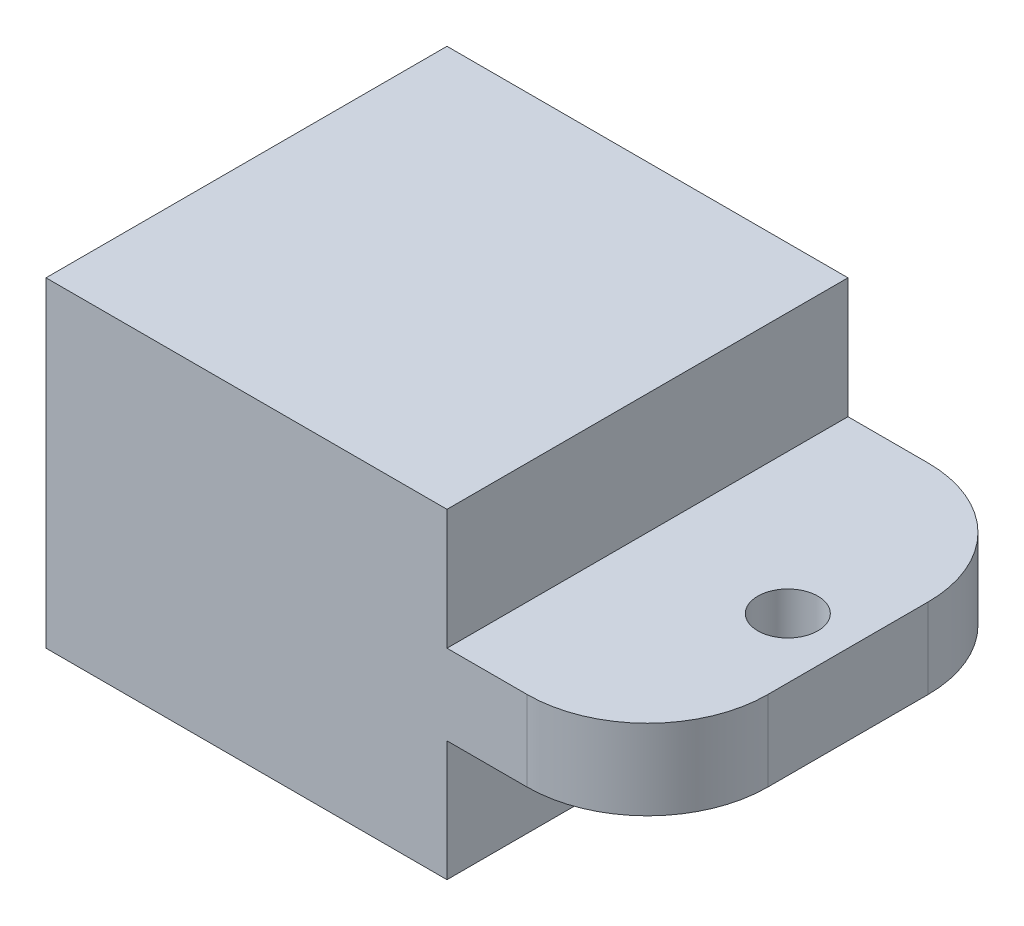
ISO-10303-21;
HEADER;
FILE_DESCRIPTION(('STEP AP214'),'2;1');
FILE_NAME('part.step','',(''),(''),'','','');
FILE_SCHEMA(('AUTOMOTIVE_DESIGN { 1 0 10303 214 1 1 1 1 }'));
ENDSEC;
DATA;
#1=APPLICATION_CONTEXT('core data for automotive mechanical design processes');
#2=APPLICATION_PROTOCOL_DEFINITION('international standard','automotive_design',2000,#1);
#3=PRODUCT_CONTEXT('',#1,'mechanical');
#4=PRODUCT('Part','Part','',(#3));
#5=PRODUCT_RELATED_PRODUCT_CATEGORY('part','',(#4));
#6=PRODUCT_DEFINITION_FORMATION('','',#4);
#7=PRODUCT_DEFINITION_CONTEXT('part definition',#1,'design');
#8=PRODUCT_DEFINITION('design','',#6,#7);
#9=PRODUCT_DEFINITION_SHAPE('','',#8);
#10=(LENGTH_UNIT() NAMED_UNIT(*) SI_UNIT(.MILLI.,.METRE.));
#11=(NAMED_UNIT(*) PLANE_ANGLE_UNIT() SI_UNIT($,.RADIAN.));
#12=(NAMED_UNIT(*) SI_UNIT($,.STERADIAN.) SOLID_ANGLE_UNIT());
#13=UNCERTAINTY_MEASURE_WITH_UNIT(LENGTH_MEASURE(1.E-05),#10,'distance_accuracy_value','');
#14=(GEOMETRIC_REPRESENTATION_CONTEXT(3) GLOBAL_UNCERTAINTY_ASSIGNED_CONTEXT((#13)) GLOBAL_UNIT_ASSIGNED_CONTEXT((#10,
#11,#12)) REPRESENTATION_CONTEXT('',''));
#15=CARTESIAN_POINT('',(0.,0.,0.));
#16=DIRECTION('',(0.,0.,1.));
#17=DIRECTION('',(1.,0.,0.));
#18=AXIS2_PLACEMENT_3D('',#15,#16,#17);
#19=CARTESIAN_POINT('',(-75.,0.,-50.));
#20=DIRECTION('',(-1.,0.,0.));
#21=DIRECTION('',(0.,0.,1.));
#22=AXIS2_PLACEMENT_3D('',#19,#20,#21);
#23=PLANE('',#22);
#24=DIRECTION('',(0.,-1.,0.));
#25=VECTOR('',#24,1.);
#26=CARTESIAN_POINT('',(-75.,0.,-50.));
#27=LINE('',#26,#25);
#28=CARTESIAN_POINT('',(-75.,40.,-50.));
#29=VERTEX_POINT('',#28);
#30=CARTESIAN_POINT('',(-75.,-40.,-50.));
#31=VERTEX_POINT('',#30);
#32=EDGE_CURVE('E136',#29,#31,#27,.T.);
#33=ORIENTED_EDGE('',*,*,#32,.T.);
#34=DIRECTION('',(0.,0.,1.));
#35=VECTOR('',#34,1.);
#36=CARTESIAN_POINT('',(-75.,-40.,-50.));
#37=LINE('',#36,#35);
#38=CARTESIAN_POINT('',(-75.,-40.,50.));
#39=VERTEX_POINT('',#38);
#40=EDGE_CURVE('E134',#31,#39,#37,.T.);
#41=ORIENTED_EDGE('',*,*,#40,.T.);
#42=DIRECTION('',(0.,-1.,0.));
#43=VECTOR('',#42,1.);
#44=CARTESIAN_POINT('',(-75.,0.,50.));
#45=LINE('',#44,#43);
#46=CARTESIAN_POINT('',(-75.,40.,50.));
#47=VERTEX_POINT('',#46);
#48=EDGE_CURVE('E118',#47,#39,#45,.T.);
#49=ORIENTED_EDGE('',*,*,#48,.F.);
#50=DIRECTION('',(0.,0.,1.));
#51=VECTOR('',#50,1.);
#52=CARTESIAN_POINT('',(-75.,40.,-50.));
#53=LINE('',#52,#51);
#54=EDGE_CURVE('E199',#29,#47,#53,.T.);
#55=ORIENTED_EDGE('',*,*,#54,.F.);
#56=EDGE_LOOP('',(#33,#41,#49,#55));
#57=FACE_BOUND('',#56,.T.);
#58=ADVANCED_FACE('F39',(#57),#23,.T.);
#59=CARTESIAN_POINT('',(-75.,40.,-50.));
#60=DIRECTION('',(0.,1.,0.));
#61=DIRECTION('',(-1.,0.,0.));
#62=AXIS2_PLACEMENT_3D('',#59,#60,#61);
#63=PLANE('',#62);
#64=ORIENTED_EDGE('',*,*,#54,.T.);
#65=DIRECTION('',(-1.,0.,0.));
#66=VECTOR('',#65,1.);
#67=CARTESIAN_POINT('',(-75.,40.,50.));
#68=LINE('',#67,#66);
#69=CARTESIAN_POINT('',(25.,40.,50.));
#70=VERTEX_POINT('',#69);
#71=EDGE_CURVE('E128',#70,#47,#68,.T.);
#72=ORIENTED_EDGE('',*,*,#71,.F.);
#73=DIRECTION('',(0.,0.,1.));
#74=VECTOR('',#73,1.);
#75=CARTESIAN_POINT('',(25.,40.,-50.));
#76=LINE('',#75,#74);
#77=CARTESIAN_POINT('',(25.,40.,-50.));
#78=VERTEX_POINT('',#77);
#79=EDGE_CURVE('E203',#78,#70,#76,.T.);
#80=ORIENTED_EDGE('',*,*,#79,.F.);
#81=DIRECTION('',(-1.,0.,0.));
#82=VECTOR('',#81,1.);
#83=CARTESIAN_POINT('',(-75.,40.,-50.));
#84=LINE('',#83,#82);
#85=EDGE_CURVE('E192',#78,#29,#84,.T.);
#86=ORIENTED_EDGE('',*,*,#85,.T.);
#87=EDGE_LOOP('',(#64,#72,#80,#86));
#88=FACE_BOUND('',#87,.T.);
#89=ADVANCED_FACE('F241',(#88),#63,.T.);
#90=CARTESIAN_POINT('',(25.,40.,-50.));
#91=DIRECTION('',(1.,0.,0.));
#92=DIRECTION('',(0.,1.,0.));
#93=AXIS2_PLACEMENT_3D('',#90,#91,#92);
#94=PLANE('',#93);
#95=ORIENTED_EDGE('',*,*,#79,.T.);
#96=DIRECTION('',(0.,1.,0.));
#97=VECTOR('',#96,1.);
#98=CARTESIAN_POINT('',(25.,40.,50.));
#99=LINE('',#98,#97);
#100=CARTESIAN_POINT('',(25.,10.,50.));
#101=VERTEX_POINT('',#100);
#102=EDGE_CURVE('E181',#101,#70,#99,.T.);
#103=ORIENTED_EDGE('',*,*,#102,.F.);
#104=DIRECTION('',(0.,0.,1.));
#105=VECTOR('',#104,1.);
#106=CARTESIAN_POINT('',(25.,10.,-50.));
#107=LINE('',#106,#105);
#108=CARTESIAN_POINT('',(25.,10.,-50.));
#109=VERTEX_POINT('',#108);
#110=EDGE_CURVE('E206',#109,#101,#107,.T.);
#111=ORIENTED_EDGE('',*,*,#110,.F.);
#112=DIRECTION('',(0.,1.,0.));
#113=VECTOR('',#112,1.);
#114=CARTESIAN_POINT('',(25.,40.,-50.));
#115=LINE('',#114,#113);
#116=EDGE_CURVE('E188',#109,#78,#115,.T.);
#117=ORIENTED_EDGE('',*,*,#116,.T.);
#118=EDGE_LOOP('',(#95,#103,#111,#117));
#119=FACE_BOUND('',#118,.T.);
#120=ADVANCED_FACE('F239',(#119),#94,.T.);
#121=CARTESIAN_POINT('',(25.,10.,-50.));
#122=DIRECTION('',(0.,1.,0.));
#123=DIRECTION('',(0.,0.,1.));
#124=AXIS2_PLACEMENT_3D('',#121,#122,#123);
#125=PLANE('',#124);
#126=CARTESIAN_POINT('',(60.,10.,0.));
#127=DIRECTION('',(0.,1.,0.));
#128=DIRECTION('',(0.,0.,1.));
#129=AXIS2_PLACEMENT_3D('',#126,#127,#128);
#130=CIRCLE('',#129,7.50000000000001);
#131=CARTESIAN_POINT('',(60.,10.,7.50000000000001));
#132=VERTEX_POINT('',#131);
#133=EDGE_CURVE('E155',#132,#132,#130,.T.);
#134=ORIENTED_EDGE('',*,*,#133,.F.);
#135=EDGE_LOOP('',(#134));
#136=FACE_BOUND('',#135,.T.);
#137=DIRECTION('',(-1.,0.,0.));
#138=VECTOR('',#137,1.);
#139=CARTESIAN_POINT('',(25.,10.,50.));
#140=LINE('',#139,#138);
#141=CARTESIAN_POINT('',(45.,10.,50.));
#142=VERTEX_POINT('',#141);
#143=EDGE_CURVE('E172',#142,#101,#140,.T.);
#144=ORIENTED_EDGE('',*,*,#143,.F.);
#145=CARTESIAN_POINT('',(45.,10.,20.));
#146=DIRECTION('',(0.,1.,0.));
#147=DIRECTION('',(0.,0.,1.));
#148=AXIS2_PLACEMENT_3D('',#145,#146,#147);
#149=CIRCLE('',#148,30.);
#150=CARTESIAN_POINT('',(75.,10.,20.));
#151=VERTEX_POINT('',#150);
#152=EDGE_CURVE('E62',#142,#151,#149,.T.);
#153=ORIENTED_EDGE('',*,*,#152,.T.);
#154=DIRECTION('',(0.,0.,1.));
#155=VECTOR('',#154,1.);
#156=CARTESIAN_POINT('',(75.,10.,-50.));
#157=LINE('',#156,#155);
#158=CARTESIAN_POINT('',(75.,10.,-20.));
#159=VERTEX_POINT('',#158);
#160=EDGE_CURVE('E198',#159,#151,#157,.T.);
#161=ORIENTED_EDGE('',*,*,#160,.F.);
#162=CARTESIAN_POINT('',(45.,10.,-20.));
#163=DIRECTION('',(0.,1.,0.));
#164=DIRECTION('',(0.,0.,1.));
#165=AXIS2_PLACEMENT_3D('',#162,#163,#164);
#166=CIRCLE('',#165,30.);
#167=CARTESIAN_POINT('',(45.,10.,-50.));
#168=VERTEX_POINT('',#167);
#169=EDGE_CURVE('E215',#159,#168,#166,.T.);
#170=ORIENTED_EDGE('',*,*,#169,.T.);
#171=DIRECTION('',(-1.,0.,0.));
#172=VECTOR('',#171,1.);
#173=CARTESIAN_POINT('',(25.,10.,-50.));
#174=LINE('',#173,#172);
#175=EDGE_CURVE('E131',#168,#109,#174,.T.);
#176=ORIENTED_EDGE('',*,*,#175,.T.);
#177=ORIENTED_EDGE('',*,*,#110,.T.);
#178=EDGE_LOOP('',(#144,#153,#161,#170,#176,#177));
#179=FACE_BOUND('',#178,.T.);
#180=ADVANCED_FACE('F233',(#136,#179),#125,.T.);
#181=CARTESIAN_POINT('',(75.,10.,-50.));
#182=DIRECTION('',(1.,0.,0.));
#183=DIRECTION('',(0.,0.,-1.));
#184=AXIS2_PLACEMENT_3D('',#181,#182,#183);
#185=PLANE('',#184);
#186=ORIENTED_EDGE('',*,*,#160,.T.);
#187=DIRECTION('',(0.,1.,0.));
#188=VECTOR('',#187,1.);
#189=CARTESIAN_POINT('',(75.,-10.,20.));
#190=LINE('',#189,#188);
#191=CARTESIAN_POINT('',(75.,-10.,20.));
#192=VERTEX_POINT('',#191);
#193=EDGE_CURVE('E48',#151,#192,#190,.F.);
#194=ORIENTED_EDGE('',*,*,#193,.T.);
#195=DIRECTION('',(0.,0.,1.));
#196=VECTOR('',#195,1.);
#197=CARTESIAN_POINT('',(75.,-10.,-50.));
#198=LINE('',#197,#196);
#199=CARTESIAN_POINT('',(75.,-10.,-20.));
#200=VERTEX_POINT('',#199);
#201=EDGE_CURVE('E169',#200,#192,#198,.T.);
#202=ORIENTED_EDGE('',*,*,#201,.F.);
#203=DIRECTION('',(0.,1.,0.));
#204=VECTOR('',#203,1.);
#205=CARTESIAN_POINT('',(75.,10.,-20.));
#206=LINE('',#205,#204);
#207=EDGE_CURVE('E202',#200,#159,#206,.T.);
#208=ORIENTED_EDGE('',*,*,#207,.T.);
#209=EDGE_LOOP('',(#186,#194,#202,#208));
#210=FACE_BOUND('',#209,.T.);
#211=ADVANCED_FACE('F273',(#210),#185,.T.);
#212=CARTESIAN_POINT('',(0.,0.,-50.));
#213=DIRECTION('',(0.,0.,-1.));
#214=DIRECTION('',(-1.,0.,0.));
#215=AXIS2_PLACEMENT_3D('',#212,#213,#214);
#216=PLANE('',#215);
#217=ORIENTED_EDGE('',*,*,#175,.F.);
#218=DIRECTION('',(0.,1.,0.));
#219=VECTOR('',#218,1.);
#220=CARTESIAN_POINT('',(45.,0.,-50.));
#221=LINE('',#220,#219);
#222=CARTESIAN_POINT('',(45.,-10.,-50.));
#223=VERTEX_POINT('',#222);
#224=EDGE_CURVE('E218',#168,#223,#221,.F.);
#225=ORIENTED_EDGE('',*,*,#224,.T.);
#226=DIRECTION('',(-1.,0.,0.));
#227=VECTOR('',#226,1.);
#228=CARTESIAN_POINT('',(25.,-10.,-50.));
#229=LINE('',#228,#227);
#230=CARTESIAN_POINT('',(25.,-10.,-50.));
#231=VERTEX_POINT('',#230);
#232=EDGE_CURVE('E142',#223,#231,#229,.T.);
#233=ORIENTED_EDGE('',*,*,#232,.T.);
#234=DIRECTION('',(0.,-1.,0.));
#235=VECTOR('',#234,1.);
#236=CARTESIAN_POINT('',(25.,-40.,-50.));
#237=LINE('',#236,#235);
#238=CARTESIAN_POINT('',(25.,-40.,-50.));
#239=VERTEX_POINT('',#238);
#240=EDGE_CURVE('E164',#231,#239,#237,.T.);
#241=ORIENTED_EDGE('',*,*,#240,.T.);
#242=DIRECTION('',(-1.,0.,0.));
#243=VECTOR('',#242,1.);
#244=CARTESIAN_POINT('',(-75.,-40.,-50.));
#245=LINE('',#244,#243);
#246=EDGE_CURVE('E161',#239,#31,#245,.T.);
#247=ORIENTED_EDGE('',*,*,#246,.T.);
#248=ORIENTED_EDGE('',*,*,#32,.F.);
#249=ORIENTED_EDGE('',*,*,#85,.F.);
#250=ORIENTED_EDGE('',*,*,#116,.F.);
#251=EDGE_LOOP('',(#217,#225,#233,#241,#247,#248,#249,#250));
#252=FACE_BOUND('',#251,.T.);
#253=ADVANCED_FACE('F244',(#252),#216,.T.);
#254=CARTESIAN_POINT('',(0.,0.,50.));
#255=DIRECTION('',(0.,0.,-1.));
#256=DIRECTION('',(-1.,0.,0.));
#257=AXIS2_PLACEMENT_3D('',#254,#255,#256);
#258=PLANE('',#257);
#259=DIRECTION('',(-1.,0.,0.));
#260=VECTOR('',#259,1.);
#261=CARTESIAN_POINT('',(25.,-10.,50.));
#262=LINE('',#261,#260);
#263=CARTESIAN_POINT('',(45.,-10.,50.));
#264=VERTEX_POINT('',#263);
#265=CARTESIAN_POINT('',(25.,-10.,50.));
#266=VERTEX_POINT('',#265);
#267=EDGE_CURVE('E152',#264,#266,#262,.T.);
#268=ORIENTED_EDGE('',*,*,#267,.F.);
#269=DIRECTION('',(0.,1.,0.));
#270=VECTOR('',#269,1.);
#271=CARTESIAN_POINT('',(45.,10.,50.));
#272=LINE('',#271,#270);
#273=EDGE_CURVE('E224',#264,#142,#272,.T.);
#274=ORIENTED_EDGE('',*,*,#273,.T.);
#275=ORIENTED_EDGE('',*,*,#143,.T.);
#276=ORIENTED_EDGE('',*,*,#102,.T.);
#277=ORIENTED_EDGE('',*,*,#71,.T.);
#278=ORIENTED_EDGE('',*,*,#48,.T.);
#279=DIRECTION('',(-1.,0.,0.));
#280=VECTOR('',#279,1.);
#281=CARTESIAN_POINT('',(-75.,-40.,50.));
#282=LINE('',#281,#280);
#283=CARTESIAN_POINT('',(25.,-40.,50.));
#284=VERTEX_POINT('',#283);
#285=EDGE_CURVE('E124',#284,#39,#282,.T.);
#286=ORIENTED_EDGE('',*,*,#285,.F.);
#287=DIRECTION('',(0.,-1.,0.));
#288=VECTOR('',#287,1.);
#289=CARTESIAN_POINT('',(25.,-40.,50.));
#290=LINE('',#289,#288);
#291=EDGE_CURVE('E147',#266,#284,#290,.T.);
#292=ORIENTED_EDGE('',*,*,#291,.F.);
#293=EDGE_LOOP('',(#268,#274,#275,#276,#277,#278,#286,#292));
#294=FACE_BOUND('',#293,.T.);
#295=ADVANCED_FACE('F121',(#294),#258,.F.);
#296=CARTESIAN_POINT('',(25.,-10.,-50.));
#297=DIRECTION('',(0.,1.,0.));
#298=DIRECTION('',(0.,0.,1.));
#299=AXIS2_PLACEMENT_3D('',#296,#297,#298);
#300=PLANE('',#299);
#301=CARTESIAN_POINT('',(60.,-10.,0.));
#302=DIRECTION('',(0.,1.,0.));
#303=DIRECTION('',(0.,0.,1.));
#304=AXIS2_PLACEMENT_3D('',#301,#302,#303);
#305=CIRCLE('',#304,7.50000000000001);
#306=CARTESIAN_POINT('',(60.,-10.,7.50000000000001));
#307=VERTEX_POINT('',#306);
#308=EDGE_CURVE('E148',#307,#307,#305,.T.);
#309=ORIENTED_EDGE('',*,*,#308,.T.);
#310=EDGE_LOOP('',(#309));
#311=FACE_BOUND('',#310,.T.);
#312=ORIENTED_EDGE('',*,*,#201,.T.);
#313=CARTESIAN_POINT('',(45.,-10.,20.));
#314=DIRECTION('',(0.,1.,0.));
#315=DIRECTION('',(0.,0.,1.));
#316=AXIS2_PLACEMENT_3D('',#313,#314,#315);
#317=CIRCLE('',#316,30.);
#318=EDGE_CURVE('E11',#192,#264,#317,.F.);
#319=ORIENTED_EDGE('',*,*,#318,.T.);
#320=ORIENTED_EDGE('',*,*,#267,.T.);
#321=DIRECTION('',(0.,0.,1.));
#322=VECTOR('',#321,1.);
#323=CARTESIAN_POINT('',(25.,-10.,-50.));
#324=LINE('',#323,#322);
#325=EDGE_CURVE('E173',#231,#266,#324,.T.);
#326=ORIENTED_EDGE('',*,*,#325,.F.);
#327=ORIENTED_EDGE('',*,*,#232,.F.);
#328=CARTESIAN_POINT('',(45.,-10.,-20.));
#329=DIRECTION('',(0.,1.,0.));
#330=DIRECTION('',(0.,0.,1.));
#331=AXIS2_PLACEMENT_3D('',#328,#329,#330);
#332=CIRCLE('',#331,30.);
#333=EDGE_CURVE('E221',#223,#200,#332,.F.);
#334=ORIENTED_EDGE('',*,*,#333,.T.);
#335=EDGE_LOOP('',(#312,#319,#320,#326,#327,#334));
#336=FACE_BOUND('',#335,.T.);
#337=ADVANCED_FACE('F251',(#311,#336),#300,.F.);
#338=CARTESIAN_POINT('',(25.,-40.,-50.));
#339=DIRECTION('',(-1.,0.,0.));
#340=DIRECTION('',(0.,-1.,0.));
#341=AXIS2_PLACEMENT_3D('',#338,#339,#340);
#342=PLANE('',#341);
#343=ORIENTED_EDGE('',*,*,#325,.T.);
#344=ORIENTED_EDGE('',*,*,#291,.T.);
#345=DIRECTION('',(0.,0.,1.));
#346=VECTOR('',#345,1.);
#347=CARTESIAN_POINT('',(25.,-40.,-50.));
#348=LINE('',#347,#346);
#349=EDGE_CURVE('E141',#239,#284,#348,.T.);
#350=ORIENTED_EDGE('',*,*,#349,.F.);
#351=ORIENTED_EDGE('',*,*,#240,.F.);
#352=EDGE_LOOP('',(#343,#344,#350,#351));
#353=FACE_BOUND('',#352,.T.);
#354=ADVANCED_FACE('F249',(#353),#342,.F.);
#355=CARTESIAN_POINT('',(-75.,-40.,-50.));
#356=DIRECTION('',(0.,1.,0.));
#357=DIRECTION('',(-1.,0.,0.));
#358=AXIS2_PLACEMENT_3D('',#355,#356,#357);
#359=PLANE('',#358);
#360=ORIENTED_EDGE('',*,*,#349,.T.);
#361=ORIENTED_EDGE('',*,*,#285,.T.);
#362=ORIENTED_EDGE('',*,*,#40,.F.);
#363=ORIENTED_EDGE('',*,*,#246,.F.);
#364=EDGE_LOOP('',(#360,#361,#362,#363));
#365=FACE_BOUND('',#364,.T.);
#366=ADVANCED_FACE('F144',(#365),#359,.F.);
#367=CARTESIAN_POINT('',(60.,-40.,0.));
#368=DIRECTION('',(0.,1.,0.));
#369=DIRECTION('',(0.,0.,1.));
#370=AXIS2_PLACEMENT_3D('',#367,#368,#369);
#371=CYLINDRICAL_SURFACE('',#370,7.50000000000001);
#372=CARTESIAN_POINT('',(60.,10.,7.50000000000001));
#373=CARTESIAN_POINT('',(60.,9.79166666666667,7.50000000000001));
#374=CARTESIAN_POINT('',(60.,9.58333333333333,7.50000000000001));
#375=CARTESIAN_POINT('',(60.,9.16666666666667,7.50000000000001));
#376=CARTESIAN_POINT('',(60.,8.95833333333333,7.50000000000001));
#377=CARTESIAN_POINT('',(60.,8.54166666666667,7.50000000000001));
#378=CARTESIAN_POINT('',(60.,8.33333333333333,7.50000000000001));
#379=CARTESIAN_POINT('',(60.,7.91666666666667,7.50000000000001));
#380=CARTESIAN_POINT('',(60.,7.70833333333333,7.50000000000001));
#381=CARTESIAN_POINT('',(60.,7.29166666666667,7.50000000000001));
#382=CARTESIAN_POINT('',(60.,7.08333333333333,7.50000000000001));
#383=CARTESIAN_POINT('',(60.,6.66666666666667,7.50000000000001));
#384=CARTESIAN_POINT('',(60.,6.45833333333333,7.50000000000001));
#385=CARTESIAN_POINT('',(60.,6.04166666666667,7.50000000000001));
#386=CARTESIAN_POINT('',(60.,5.83333333333333,7.50000000000001));
#387=CARTESIAN_POINT('',(60.,5.41666666666666,7.50000000000001));
#388=CARTESIAN_POINT('',(60.,5.20833333333333,7.50000000000001));
#389=CARTESIAN_POINT('',(60.,4.79166666666666,7.50000000000001));
#390=CARTESIAN_POINT('',(60.,4.58333333333333,7.50000000000001));
#391=CARTESIAN_POINT('',(60.,4.16666666666666,7.50000000000001));
#392=CARTESIAN_POINT('',(60.,3.95833333333333,7.50000000000001));
#393=CARTESIAN_POINT('',(60.,3.54166666666666,7.50000000000001));
#394=CARTESIAN_POINT('',(60.,3.33333333333333,7.50000000000001));
#395=CARTESIAN_POINT('',(60.,2.91666666666666,7.50000000000001));
#396=CARTESIAN_POINT('',(60.,2.70833333333333,7.50000000000001));
#397=CARTESIAN_POINT('',(60.,2.29166666666666,7.50000000000001));
#398=CARTESIAN_POINT('',(60.,2.08333333333333,7.50000000000001));
#399=CARTESIAN_POINT('',(60.,1.66666666666666,7.50000000000001));
#400=CARTESIAN_POINT('',(60.,1.45833333333333,7.50000000000001));
#401=CARTESIAN_POINT('',(60.,1.04166666666666,7.50000000000001));
#402=CARTESIAN_POINT('',(60.,0.833333333333327,7.50000000000001));
#403=CARTESIAN_POINT('',(60.,0.41666666666666,7.50000000000001));
#404=CARTESIAN_POINT('',(60.,0.208333333333327,7.50000000000001));
#405=CARTESIAN_POINT('',(60.,-0.20833333333334,7.50000000000001));
#406=CARTESIAN_POINT('',(60.,-0.416666666666674,7.50000000000001));
#407=CARTESIAN_POINT('',(60.,-0.833333333333341,7.50000000000001));
#408=CARTESIAN_POINT('',(60.,-1.04166666666667,7.50000000000001));
#409=CARTESIAN_POINT('',(60.,-1.45833333333334,7.50000000000001));
#410=CARTESIAN_POINT('',(60.,-1.66666666666668,7.50000000000001));
#411=CARTESIAN_POINT('',(60.,-2.08333333333334,7.50000000000001));
#412=CARTESIAN_POINT('',(60.,-2.29166666666668,7.50000000000001));
#413=CARTESIAN_POINT('',(60.,-2.70833333333334,7.50000000000001));
#414=CARTESIAN_POINT('',(60.,-2.91666666666667,7.50000000000001));
#415=CARTESIAN_POINT('',(60.,-3.33333333333334,7.50000000000001));
#416=CARTESIAN_POINT('',(60.,-3.54166666666667,7.50000000000001));
#417=CARTESIAN_POINT('',(60.,-3.95833333333334,7.50000000000001));
#418=CARTESIAN_POINT('',(60.,-4.16666666666667,7.50000000000001));
#419=CARTESIAN_POINT('',(60.,-4.58333333333334,7.50000000000001));
#420=CARTESIAN_POINT('',(60.,-4.79166666666667,7.50000000000001));
#421=CARTESIAN_POINT('',(60.,-5.20833333333334,7.50000000000001));
#422=CARTESIAN_POINT('',(60.,-5.41666666666667,7.50000000000001));
#423=CARTESIAN_POINT('',(60.,-5.83333333333334,7.50000000000001));
#424=CARTESIAN_POINT('',(60.,-6.04166666666667,7.50000000000001));
#425=CARTESIAN_POINT('',(60.,-6.45833333333334,7.50000000000001));
#426=CARTESIAN_POINT('',(60.,-6.66666666666667,7.50000000000001));
#427=CARTESIAN_POINT('',(60.,-7.08333333333334,7.50000000000001));
#428=CARTESIAN_POINT('',(60.,-7.29166666666667,7.50000000000001));
#429=CARTESIAN_POINT('',(60.,-7.70833333333334,7.50000000000001));
#430=CARTESIAN_POINT('',(60.,-7.91666666666667,7.50000000000001));
#431=CARTESIAN_POINT('',(60.,-8.33333333333334,7.50000000000001));
#432=CARTESIAN_POINT('',(60.,-8.54166666666667,7.50000000000001));
#433=CARTESIAN_POINT('',(60.,-8.95833333333334,7.50000000000001));
#434=CARTESIAN_POINT('',(60.,-9.16666666666667,7.50000000000001));
#435=CARTESIAN_POINT('',(60.,-9.58333333333334,7.50000000000001));
#436=CARTESIAN_POINT('',(60.,-9.79166666666667,7.50000000000001));
#437=CARTESIAN_POINT('',(60.,-10.,7.50000000000001));
#438=B_SPLINE_CURVE_WITH_KNOTS('',3,(#372,#373,#374,#375,#376,#377,#378,#379,#380,#381,#382,
#383,#384,#385,#386,#387,#388,#389,#390,#391,#392,#393,#394,#395,#396,#397,#398,#399,#400,#401,
#402,#403,#404,#405,#406,#407,#408,#409,#410,#411,#412,#413,#414,#415,#416,#417,#418,#419,#420,
#421,#422,#423,#424,#425,#426,#427,#428,#429,#430,#431,#432,#433,#434,#435,#436,#437),
.UNSPECIFIED.,.F.,.F.,(4,2,2,2,2,2,2,2,2,2,2,2,2,2,2,2,2,2,2,2,2,2,2,2,2,2,2,2,2,2,2,2,4),(0.,
0.625000000000001,1.25,1.875,2.5,3.125,3.75,4.375,5.,5.62500000000001,6.25000000000001,
6.87500000000001,7.50000000000001,8.12500000000001,8.75000000000001,9.37500000000001,10.,10.625,
11.25,11.875,12.5,13.125,13.75,14.375,15.,15.625,16.25,16.875,17.5,18.125,18.75,19.375,20.),.UNSPECIFIED.);
#439=EDGE_CURVE('BSEAM258',#132,#307,#438,.T.);
#440=ORIENTED_EDGE('',*,*,#133,.T.);
#441=ORIENTED_EDGE('',*,*,#308,.F.);
#442=ORIENTED_EDGE('',*,*,#439,.T.);
#443=ORIENTED_EDGE('',*,*,#439,.F.);
#444=EDGE_LOOP('',(#440,#442,#441,#443));
#445=FACE_BOUND('',#444,.T.);
#446=ADVANCED_FACE('F258',(#445),#371,.F.);
#447=CARTESIAN_POINT('',(45.,10.,-20.));
#448=DIRECTION('',(0.,1.,0.));
#449=DIRECTION('',(0.,0.,1.));
#450=AXIS2_PLACEMENT_3D('',#447,#448,#449);
#451=CYLINDRICAL_SURFACE('',#450,30.);
#452=ORIENTED_EDGE('',*,*,#333,.F.);
#453=ORIENTED_EDGE('',*,*,#224,.F.);
#454=ORIENTED_EDGE('',*,*,#169,.F.);
#455=ORIENTED_EDGE('',*,*,#207,.F.);
#456=EDGE_LOOP('',(#452,#453,#454,#455));
#457=FACE_BOUND('',#456,.T.);
#458=ADVANCED_FACE('F254',(#457),#451,.T.);
#459=CARTESIAN_POINT('',(45.,0.,20.));
#460=DIRECTION('',(0.,-1.,0.));
#461=DIRECTION('',(0.,0.,-1.));
#462=AXIS2_PLACEMENT_3D('',#459,#460,#461);
#463=CYLINDRICAL_SURFACE('',#462,30.);
#464=ORIENTED_EDGE('',*,*,#318,.F.);
#465=ORIENTED_EDGE('',*,*,#193,.F.);
#466=ORIENTED_EDGE('',*,*,#152,.F.);
#467=ORIENTED_EDGE('',*,*,#273,.F.);
#468=EDGE_LOOP('',(#464,#465,#466,#467));
#469=FACE_BOUND('',#468,.T.);
#470=ADVANCED_FACE('F41',(#469),#463,.T.);
#471=CLOSED_SHELL('',(#58,#89,#120,#180,#211,#253,#295,#337,#354,#366,#446,#458,#470));
#472=MANIFOLD_SOLID_BREP('B2',#471);
#473=ADVANCED_BREP_SHAPE_REPRESENTATION('',(#18,#472),#14);
#474=SHAPE_DEFINITION_REPRESENTATION(#9,#473);
ENDSEC;
END-ISO-10303-21;
